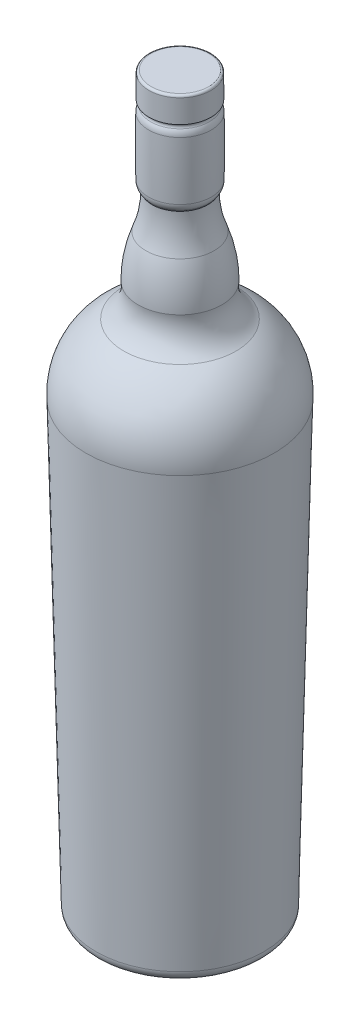
ISO-10303-21;
HEADER;
FILE_DESCRIPTION(('STEP AP214'),'2;1');
FILE_NAME('part.step','',(''),(''),'','','');
FILE_SCHEMA(('AUTOMOTIVE_DESIGN { 1 0 10303 214 1 1 1 1 }'));
ENDSEC;
DATA;
#1=APPLICATION_CONTEXT('core data for automotive mechanical design processes');
#2=APPLICATION_PROTOCOL_DEFINITION('international standard','automotive_design',2000,#1);
#3=PRODUCT_CONTEXT('',#1,'mechanical');
#4=PRODUCT('Part','Part','',(#3));
#5=PRODUCT_RELATED_PRODUCT_CATEGORY('part','',(#4));
#6=PRODUCT_DEFINITION_FORMATION('','',#4);
#7=PRODUCT_DEFINITION_CONTEXT('part definition',#1,'design');
#8=PRODUCT_DEFINITION('design','',#6,#7);
#9=PRODUCT_DEFINITION_SHAPE('','',#8);
#10=(LENGTH_UNIT() NAMED_UNIT(*) SI_UNIT(.MILLI.,.METRE.));
#11=(NAMED_UNIT(*) PLANE_ANGLE_UNIT() SI_UNIT($,.RADIAN.));
#12=(NAMED_UNIT(*) SI_UNIT($,.STERADIAN.) SOLID_ANGLE_UNIT());
#13=UNCERTAINTY_MEASURE_WITH_UNIT(LENGTH_MEASURE(1.E-05),#10,'distance_accuracy_value','');
#14=(GEOMETRIC_REPRESENTATION_CONTEXT(3) GLOBAL_UNCERTAINTY_ASSIGNED_CONTEXT((#13)) GLOBAL_UNIT_ASSIGNED_CONTEXT((#10,
#11,#12)) REPRESENTATION_CONTEXT('',''));
#15=CARTESIAN_POINT('',(0.,0.,0.));
#16=DIRECTION('',(0.,0.,1.));
#17=DIRECTION('',(1.,0.,0.));
#18=AXIS2_PLACEMENT_3D('',#15,#16,#17);
#19=CARTESIAN_POINT('',(920.92834183409,303.270607144107,0.));
#20=DIRECTION('',(0.,-1.,0.));
#21=DIRECTION('',(0.,0.,-1.));
#22=AXIS2_PLACEMENT_3D('',#19,#20,#21);
#23=PLANE('',#22);
#24=CARTESIAN_POINT('',(905.205998229429,303.270607144107,0.));
#25=DIRECTION('',(0.,1.,0.));
#26=DIRECTION('',(0.,0.,1.));
#27=AXIS2_PLACEMENT_3D('',#24,#25,#26);
#28=CIRCLE('',#27,15.7223436046606);
#29=CARTESIAN_POINT('',(905.205998229429,303.270607144107,15.7223436046606));
#30=VERTEX_POINT('',#29);
#31=EDGE_CURVE('E65',#30,#30,#28,.T.);
#32=ORIENTED_EDGE('',*,*,#31,.T.);
#33=EDGE_LOOP('',(#32));
#34=FACE_BOUND('',#33,.T.);
#35=ADVANCED_FACE('F40',(#34),#23,.F.);
#36=CARTESIAN_POINT('',(905.205998229429,40.2910251286174,0.));
#37=DIRECTION('',(0.,1.,0.));
#38=DIRECTION('',(-1.,0.,0.));
#39=AXIS2_PLACEMENT_3D('',#36,#37,#38);
#40=SPHERICAL_SURFACE('',#39,28.1);
#41=CARTESIAN_POINT('',(905.205998229429,59.05547695586,0.));
#42=DIRECTION('',(0.,1.,0.));
#43=DIRECTION('',(0.,0.,1.));
#44=AXIS2_PLACEMENT_3D('',#41,#42,#43);
#45=CIRCLE('',#44,20.9166284956035);
#46=CARTESIAN_POINT('',(905.205998229429,59.05547695586,20.9166284956035));
#47=VERTEX_POINT('',#46);
#48=EDGE_CURVE('E11',#47,#47,#45,.T.);
#49=ORIENTED_EDGE('',*,*,#48,.F.);
#50=EDGE_LOOP('',(#49));
#51=FACE_BOUND('',#50,.T.);
#52=ADVANCED_FACE('F101',(#51),#40,.F.);
#53=CARTESIAN_POINT('',(905.205998229429,60.3910251286174,0.));
#54=DIRECTION('',(0.,1.,0.));
#55=DIRECTION('',(0.,0.,1.));
#56=AXIS2_PLACEMENT_3D('',#53,#54,#55);
#57=TOROIDAL_SURFACE('',#56,22.405356502408,2.00000000000001);
#58=CARTESIAN_POINT('',(905.205998229429,58.3910251286174,0.));
#59=DIRECTION('',(0.,1.,0.));
#60=DIRECTION('',(0.,0.,1.));
#61=AXIS2_PLACEMENT_3D('',#58,#59,#60);
#62=CIRCLE('',#61,22.405356502408);
#63=CARTESIAN_POINT('',(905.205998229429,58.3910251286174,22.405356502408));
#64=VERTEX_POINT('',#63);
#65=EDGE_CURVE('E46',#64,#64,#62,.T.);
#66=ORIENTED_EDGE('',*,*,#65,.F.);
#67=EDGE_LOOP('',(#66));
#68=FACE_BOUND('',#67,.T.);
#69=ORIENTED_EDGE('',*,*,#48,.T.);
#70=EDGE_LOOP('',(#69));
#71=FACE_BOUND('',#70,.T.);
#72=ADVANCED_FACE('F96',(#68,#71),#57,.T.);
#73=CARTESIAN_POINT('',(927.611354731837,58.3910251286174,0.));
#74=DIRECTION('',(0.,1.,0.));
#75=DIRECTION('',(0.,0.,1.));
#76=AXIS2_PLACEMENT_3D('',#73,#74,#75);
#77=PLANE('',#76);
#78=CARTESIAN_POINT('',(905.205998229429,58.3910251286174,0.));
#79=DIRECTION('',(0.,1.,0.));
#80=DIRECTION('',(0.,0.,1.));
#81=AXIS2_PLACEMENT_3D('',#78,#79,#80);
#82=CIRCLE('',#81,32.7422963248204);
#83=CARTESIAN_POINT('',(905.205998229429,58.3910251286174,32.7422963248204));
#84=VERTEX_POINT('',#83);
#85=EDGE_CURVE('E50',#84,#84,#82,.T.);
#86=ORIENTED_EDGE('',*,*,#85,.F.);
#87=EDGE_LOOP('',(#86));
#88=FACE_BOUND('',#87,.T.);
#89=ORIENTED_EDGE('',*,*,#65,.T.);
#90=EDGE_LOOP('',(#89));
#91=FACE_BOUND('',#90,.T.);
#92=ADVANCED_FACE('F91',(#88,#91),#77,.F.);
#93=CARTESIAN_POINT('',(905.205998229429,60.3910251286174,0.));
#94=DIRECTION('',(0.,1.,0.));
#95=DIRECTION('',(0.,0.,1.));
#96=AXIS2_PLACEMENT_3D('',#93,#94,#95);
#97=TOROIDAL_SURFACE('',#96,32.7422963248205,1.99999999999998);
#98=CARTESIAN_POINT('',(905.205998229429,60.3446642904877,0.));
#99=DIRECTION('',(0.,1.,0.));
#100=DIRECTION('',(0.,0.,1.));
#101=AXIS2_PLACEMENT_3D('',#98,#99,#100);
#102=CIRCLE('',#101,34.7417589207917);
#103=CARTESIAN_POINT('',(905.205998229429,60.3446642904877,34.7417589207917));
#104=VERTEX_POINT('',#103);
#105=EDGE_CURVE('E54',#104,#104,#102,.T.);
#106=ORIENTED_EDGE('',*,*,#105,.F.);
#107=EDGE_LOOP('',(#106));
#108=FACE_BOUND('',#107,.T.);
#109=ORIENTED_EDGE('',*,*,#85,.T.);
#110=EDGE_LOOP('',(#109));
#111=FACE_BOUND('',#110,.T.);
#112=ADVANCED_FACE('F85',(#108,#111),#97,.T.);
#113=CARTESIAN_POINT('',(905.205998229429,60.3446642904877,0.));
#114=DIRECTION('',(0.,1.,0.));
#115=DIRECTION('',(0.,0.,1.));
#116=AXIS2_PLACEMENT_3D('',#113,#114,#115);
#117=CONICAL_SURFACE('',#116,34.7417589207917,0.0231824954964722);
#118=CARTESIAN_POINT('',(905.205998229429,257.104839063546,0.));
#119=DIRECTION('',(0.,1.,0.));
#120=DIRECTION('',(0.,0.,1.));
#121=AXIS2_PLACEMENT_3D('',#118,#119,#120);
#122=CIRCLE('',#121,39.3039681021037);
#123=CARTESIAN_POINT('',(905.205998229429,257.104839063546,39.3039681021037));
#124=VERTEX_POINT('',#123);
#125=EDGE_CURVE('E59',#124,#124,#122,.T.);
#126=ORIENTED_EDGE('',*,*,#125,.F.);
#127=EDGE_LOOP('',(#126));
#128=FACE_BOUND('',#127,.T.);
#129=ORIENTED_EDGE('',*,*,#105,.T.);
#130=EDGE_LOOP('',(#129));
#131=FACE_BOUND('',#130,.T.);
#132=ADVANCED_FACE('F79',(#128,#131),#117,.T.);
#133=CARTESIAN_POINT('',(905.205998229429,259.023287921556,0.));
#134=DIRECTION('',(0.,1.,0.));
#135=DIRECTION('',(0.,0.,1.));
#136=AXIS2_PLACEMENT_3D('',#133,#134,#135);
#137=DEGENERATE_TOROIDAL_SURFACE('',#136,8.99236689842386,30.3722507159368,.T.);
#138=CARTESIAN_POINT('',(905.205998229429,285.609893903162,0.));
#139=DIRECTION('',(0.,1.,0.));
#140=DIRECTION('',(0.,0.,1.));
#141=AXIS2_PLACEMENT_3D('',#138,#139,#140);
#142=CIRCLE('',#141,23.6765759656689);
#143=CARTESIAN_POINT('',(905.205998229429,285.609893903162,23.6765759656689));
#144=VERTEX_POINT('',#143);
#145=EDGE_CURVE('E62',#144,#144,#142,.T.);
#146=ORIENTED_EDGE('',*,*,#145,.F.);
#147=EDGE_LOOP('',(#146));
#148=FACE_BOUND('',#147,.T.);
#149=ORIENTED_EDGE('',*,*,#125,.T.);
#150=EDGE_LOOP('',(#149));
#151=FACE_BOUND('',#150,.T.);
#152=ADVANCED_FACE('F73',(#148,#151),#137,.T.);
#153=CARTESIAN_POINT('',(905.205998229429,300.780356638458,0.));
#154=DIRECTION('',(0.,1.,0.));
#155=DIRECTION('',(0.,0.,1.));
#156=AXIS2_PLACEMENT_3D('',#153,#154,#155);
#157=TOROIDAL_SURFACE('',#156,33.7763424973108,18.22493411776);
#158=ORIENTED_EDGE('',*,*,#31,.F.);
#159=EDGE_LOOP('',(#158));
#160=FACE_BOUND('',#159,.T.);
#161=ORIENTED_EDGE('',*,*,#145,.T.);
#162=EDGE_LOOP('',(#161));
#163=FACE_BOUND('',#162,.T.);
#164=ADVANCED_FACE('F70',(#160,#163),#157,.F.);
#165=CLOSED_SHELL('',(#35,#52,#72,#92,#112,#132,#152,#164));
#166=MANIFOLD_SOLID_BREP('B2',#165);
#167=CARTESIAN_POINT('',(905.205998229429,55.2910251286174,0.));
#168=DIRECTION('',(0.,1.,0.));
#169=DIRECTION('',(0.,0.,1.));
#170=AXIS2_PLACEMENT_3D('',#167,#168,#169);
#171=PLANE('',#170);
#172=CARTESIAN_POINT('',(905.205998229429,55.2910251286174,0.));
#173=DIRECTION('',(0.,1.,0.));
#174=DIRECTION('',(0.,0.,1.));
#175=AXIS2_PLACEMENT_3D('',#172,#173,#174);
#176=CIRCLE('',#175,22.3606797749979);
#177=CARTESIAN_POINT('',(905.205998229429,55.2910251286174,22.3606797749979));
#178=VERTEX_POINT('',#177);
#179=EDGE_CURVE('E215',#178,#178,#176,.T.);
#180=ORIENTED_EDGE('',*,*,#179,.T.);
#181=EDGE_LOOP('',(#180));
#182=FACE_BOUND('',#181,.T.);
#183=CARTESIAN_POINT('',(905.205998229429,55.2910251286174,0.));
#184=DIRECTION('',(0.,1.,0.));
#185=DIRECTION('',(0.,0.,1.));
#186=AXIS2_PLACEMENT_3D('',#183,#184,#185);
#187=CIRCLE('',#186,32.8400045373074);
#188=CARTESIAN_POINT('',(905.205998229429,55.2910251286174,32.8400045373074));
#189=VERTEX_POINT('',#188);
#190=EDGE_CURVE('E240',#189,#189,#187,.F.);
#191=ORIENTED_EDGE('',*,*,#190,.T.);
#192=EDGE_LOOP('',(#191));
#193=FACE_BOUND('',#192,.T.);
#194=ADVANCED_FACE('F156',(#182,#193),#171,.F.);
#195=CARTESIAN_POINT('',(905.205998229429,55.2910251286174,0.));
#196=DIRECTION('',(0.,1.,0.));
#197=DIRECTION('',(0.,0.,1.));
#198=AXIS2_PLACEMENT_3D('',#195,#196,#197);
#199=CONICAL_SURFACE('',#198,37.7254151616591,0.0231824954964722);
#200=CARTESIAN_POINT('',(905.205998229429,60.175123033293,0.));
#201=DIRECTION('',(0.,-1.,0.));
#202=DIRECTION('',(0.,0.,-1.));
#203=AXIS2_PLACEMENT_3D('',#200,#201,#202);
#204=CIRCLE('',#203,37.8386610272355);
#205=CARTESIAN_POINT('',(905.205998229429,60.175123033293,-37.8386610272355));
#206=VERTEX_POINT('',#205);
#207=EDGE_CURVE('E243',#206,#206,#204,.F.);
#208=ORIENTED_EDGE('',*,*,#207,.T.);
#209=EDGE_LOOP('',(#208));
#210=FACE_BOUND('',#209,.T.);
#211=CARTESIAN_POINT('',(905.205998229429,256.972458170906,0.));
#212=DIRECTION('',(0.,1.,0.));
#213=DIRECTION('',(0.,0.,1.));
#214=AXIS2_PLACEMENT_3D('',#211,#212,#213);
#215=CIRCLE('',#214,42.4017318328906);
#216=CARTESIAN_POINT('',(905.205998229429,256.972458170906,42.4017318328906));
#217=VERTEX_POINT('',#216);
#218=EDGE_CURVE('E246',#217,#217,#215,.T.);
#219=ORIENTED_EDGE('',*,*,#218,.F.);
#220=EDGE_LOOP('',(#219));
#221=FACE_BOUND('',#220,.T.);
#222=ADVANCED_FACE('F283',(#210,#221),#199,.T.);
#223=CARTESIAN_POINT('',(905.205998229429,259.023287921556,0.));
#224=DIRECTION('',(0.,1.,0.));
#225=DIRECTION('',(0.,0.,1.));
#226=AXIS2_PLACEMENT_3D('',#223,#224,#225);
#227=DEGENERATE_TOROIDAL_SURFACE('',#226,8.99236689842386,33.4722507159367,.T.);
#228=CARTESIAN_POINT('',(905.205998229429,288.256816970191,0.));
#229=DIRECTION('',(0.,1.,0.));
#230=DIRECTION('',(0.,0.,1.));
#231=AXIS2_PLACEMENT_3D('',#228,#229,#230);
#232=CIRCLE('',#231,25.2955060854982);
#233=CARTESIAN_POINT('',(905.205998229429,288.256816970191,25.2955060854982));
#234=VERTEX_POINT('',#233);
#235=EDGE_CURVE('E249',#234,#234,#232,.T.);
#236=ORIENTED_EDGE('',*,*,#235,.F.);
#237=EDGE_LOOP('',(#236));
#238=FACE_BOUND('',#237,.T.);
#239=ORIENTED_EDGE('',*,*,#218,.T.);
#240=EDGE_LOOP('',(#239));
#241=FACE_BOUND('',#240,.T.);
#242=ADVANCED_FACE('F288',(#238,#241),#227,.T.);
#243=CARTESIAN_POINT('',(905.205998229429,300.780356638458,0.));
#244=DIRECTION('',(0.,1.,0.));
#245=DIRECTION('',(0.,0.,1.));
#246=AXIS2_PLACEMENT_3D('',#243,#244,#245);
#247=TOROIDAL_SURFACE('',#246,33.7763424973108,15.12493411776);
#248=CARTESIAN_POINT('',(905.205998229429,303.051390589558,0.));
#249=DIRECTION('',(0.,1.,0.));
#250=DIRECTION('',(0.,0.,1.));
#251=AXIS2_PLACEMENT_3D('',#248,#249,#250);
#252=CIRCLE('',#251,18.8228801270256);
#253=CARTESIAN_POINT('',(905.205998229429,303.051390589558,18.8228801270256));
#254=VERTEX_POINT('',#253);
#255=EDGE_CURVE('E252',#254,#254,#252,.T.);
#256=ORIENTED_EDGE('',*,*,#255,.F.);
#257=EDGE_LOOP('',(#256));
#258=FACE_BOUND('',#257,.T.);
#259=ORIENTED_EDGE('',*,*,#235,.T.);
#260=EDGE_LOOP('',(#259));
#261=FACE_BOUND('',#260,.T.);
#262=ADVANCED_FACE('F580',(#258,#261),#247,.F.);
#263=CARTESIAN_POINT('',(905.205998229429,303.031582756078,0.));
#264=DIRECTION('',(0.,1.,0.));
#265=DIRECTION('',(0.,0.,1.));
#266=AXIS2_PLACEMENT_3D('',#263,#264,#265);
#267=DEGENERATE_TOROIDAL_SURFACE('',#266,37.1754885082419,55.9983721384969,.F.);
#268=CARTESIAN_POINT('',(905.205998229429,322.432334548043,0.));
#269=DIRECTION('',(0.,1.,0.));
#270=DIRECTION('',(0.,0.,1.));
#271=AXIS2_PLACEMENT_3D('',#268,#269,#270);
#272=CIRCLE('',#271,15.3547743129941);
#273=CARTESIAN_POINT('',(905.205998229429,322.432334548043,15.3547743129941));
#274=VERTEX_POINT('',#273);
#275=EDGE_CURVE('E255',#274,#274,#272,.T.);
#276=ORIENTED_EDGE('',*,*,#275,.F.);
#277=EDGE_LOOP('',(#276));
#278=FACE_BOUND('',#277,.T.);
#279=ORIENTED_EDGE('',*,*,#255,.T.);
#280=EDGE_LOOP('',(#279));
#281=FACE_BOUND('',#280,.T.);
#282=ADVANCED_FACE('F570',(#278,#281),#267,.F.);
#283=CARTESIAN_POINT('',(905.205998229429,337.567379504665,0.));
#284=DIRECTION('',(0.,1.,0.));
#285=DIRECTION('',(0.,0.,1.));
#286=AXIS2_PLACEMENT_3D('',#283,#284,#285);
#287=TOROIDAL_SURFACE('',#286,54.4644174558376,41.936067681645);
#288=CARTESIAN_POINT('',(905.205998229429,339.005004961465,0.));
#289=DIRECTION('',(0.,1.,0.));
#290=DIRECTION('',(0.,0.,1.));
#291=AXIS2_PLACEMENT_3D('',#288,#289,#290);
#292=CIRCLE('',#291,12.5529988966255);
#293=CARTESIAN_POINT('',(905.205998229429,339.005004961465,12.5529988966255));
#294=VERTEX_POINT('',#293);
#295=EDGE_CURVE('E258',#294,#294,#292,.T.);
#296=ORIENTED_EDGE('',*,*,#295,.F.);
#297=EDGE_LOOP('',(#296));
#298=FACE_BOUND('',#297,.T.);
#299=ORIENTED_EDGE('',*,*,#275,.T.);
#300=EDGE_LOOP('',(#299));
#301=FACE_BOUND('',#300,.T.);
#302=ADVANCED_FACE('F548',(#298,#301),#287,.F.);
#303=CARTESIAN_POINT('',(905.205998229429,338.453173654689,0.));
#304=DIRECTION('',(0.,1.,0.));
#305=DIRECTION('',(0.,0.,1.));
#306=AXIS2_PLACEMENT_3D('',#303,#304,#305);
#307=TOROIDAL_SURFACE('',#306,14.264652004757,1.79840878381818);
#308=CARTESIAN_POINT('',(905.205998229429,339.620111566195,0.));
#309=DIRECTION('',(0.,-1.,0.));
#310=DIRECTION('',(0.,0.,-1.));
#311=AXIS2_PLACEMENT_3D('',#308,#309,#310);
#312=CIRCLE('',#311,12.896247801166);
#313=CARTESIAN_POINT('',(905.205998229429,339.620111566195,-12.896247801166));
#314=VERTEX_POINT('',#313);
#315=EDGE_CURVE('E231',#314,#314,#312,.T.);
#316=ORIENTED_EDGE('',*,*,#315,.T.);
#317=EDGE_LOOP('',(#316));
#318=FACE_BOUND('',#317,.T.);
#319=ORIENTED_EDGE('',*,*,#295,.T.);
#320=EDGE_LOOP('',(#319));
#321=FACE_BOUND('',#320,.T.);
#322=ADVANCED_FACE('F279',(#318,#321),#307,.F.);
#323=CARTESIAN_POINT('',(905.205998229429,355.661055590829,0.));
#324=DIRECTION('',(0.,1.,0.));
#325=DIRECTION('',(0.,0.,1.));
#326=AXIS2_PLACEMENT_3D('',#323,#324,#325);
#327=DEGENERATE_TOROIDAL_SURFACE('',#326,580.214609807362,594.445291895973,.F.);
#328=CARTESIAN_POINT('',(905.205998229429,342.755926147209,0.));
#329=DIRECTION('',(0.,1.,0.));
#330=DIRECTION('',(0.,0.,1.));
#331=AXIS2_PLACEMENT_3D('',#328,#329,#330);
#332=CIRCLE('',#331,14.0905834152216);
#333=CARTESIAN_POINT('',(905.205998229429,342.755926147209,14.0905834152216));
#334=VERTEX_POINT('',#333);
#335=EDGE_CURVE('E234',#334,#334,#332,.T.);
#336=ORIENTED_EDGE('',*,*,#335,.T.);
#337=EDGE_LOOP('',(#336));
#338=FACE_BOUND('',#337,.T.);
#339=CARTESIAN_POINT('',(905.205998229429,368.905535345722,0.));
#340=DIRECTION('',(0.,-1.,0.));
#341=DIRECTION('',(0.,0.,-1.));
#342=AXIS2_PLACEMENT_3D('',#339,#340,#341);
#343=CIRCLE('',#342,14.0831176098908);
#344=CARTESIAN_POINT('',(905.205998229429,368.905535345722,-14.0831176098908));
#345=VERTEX_POINT('',#344);
#346=EDGE_CURVE('E237',#345,#345,#343,.T.);
#347=ORIENTED_EDGE('',*,*,#346,.T.);
#348=EDGE_LOOP('',(#347));
#349=FACE_BOUND('',#348,.T.);
#350=ADVANCED_FACE('F269',(#338,#349),#327,.F.);
#351=CARTESIAN_POINT('',(905.205998229429,372.46552676804,0.));
#352=DIRECTION('',(0.,1.,0.));
#353=DIRECTION('',(0.,0.,1.));
#354=AXIS2_PLACEMENT_3D('',#351,#352,#353);
#355=TOROIDAL_SURFACE('',#354,14.3449680747886,1.41507128629271);
#356=CARTESIAN_POINT('',(905.205998229429,371.655670853562,0.));
#357=DIRECTION('',(0.,1.,0.));
#358=DIRECTION('',(0.,0.,1.));
#359=AXIS2_PLACEMENT_3D('',#356,#357,#358);
#360=CIRCLE('',#359,13.184554293814);
#361=CARTESIAN_POINT('',(905.205998229429,371.655670853562,13.184554293814));
#362=VERTEX_POINT('',#361);
#363=EDGE_CURVE('E228',#362,#362,#360,.T.);
#364=ORIENTED_EDGE('',*,*,#363,.T.);
#365=EDGE_LOOP('',(#364));
#366=FACE_BOUND('',#365,.T.);
#367=CARTESIAN_POINT('',(905.205998229429,373.827048959516,0.));
#368=DIRECTION('',(0.,1.,0.));
#369=DIRECTION('',(0.,0.,1.));
#370=AXIS2_PLACEMENT_3D('',#367,#368,#369);
#371=CIRCLE('',#370,13.9593723442542);
#372=CARTESIAN_POINT('',(905.205998229429,373.827048959516,13.9593723442542));
#373=VERTEX_POINT('',#372);
#374=EDGE_CURVE('E261',#373,#373,#371,.T.);
#375=ORIENTED_EDGE('',*,*,#374,.F.);
#376=EDGE_LOOP('',(#375));
#377=FACE_BOUND('',#376,.T.);
#378=ADVANCED_FACE('F267',(#366,#377),#355,.F.);
#379=CARTESIAN_POINT('',(905.205998229429,385.291025128617,0.));
#380=DIRECTION('',(0.,1.,0.));
#381=DIRECTION('',(0.,0.,1.));
#382=AXIS2_PLACEMENT_3D('',#379,#380,#381);
#383=CYLINDRICAL_SURFACE('',#382,13.9593723442542);
#384=CARTESIAN_POINT('',(905.205998229429,384.291025128617,0.));
#385=DIRECTION('',(0.,-1.,0.));
#386=DIRECTION('',(0.,0.,-1.));
#387=AXIS2_PLACEMENT_3D('',#384,#385,#386);
#388=CIRCLE('',#387,13.9593723442542);
#389=CARTESIAN_POINT('',(905.205998229429,384.291025128617,-13.9593723442542));
#390=VERTEX_POINT('',#389);
#391=EDGE_CURVE('E219',#390,#390,#388,.T.);
#392=ORIENTED_EDGE('',*,*,#391,.T.);
#393=EDGE_LOOP('',(#392));
#394=FACE_BOUND('',#393,.T.);
#395=ORIENTED_EDGE('',*,*,#374,.T.);
#396=EDGE_LOOP('',(#395));
#397=FACE_BOUND('',#396,.T.);
#398=ADVANCED_FACE('F265',(#394,#397),#383,.T.);
#399=CARTESIAN_POINT('',(919.165370573683,385.291025128617,0.));
#400=DIRECTION('',(0.,-1.,0.));
#401=DIRECTION('',(0.,0.,-1.));
#402=AXIS2_PLACEMENT_3D('',#399,#400,#401);
#403=PLANE('',#402);
#404=CARTESIAN_POINT('',(905.205998229429,385.291025128617,0.));
#405=DIRECTION('',(0.,-1.,0.));
#406=DIRECTION('',(0.,0.,-1.));
#407=AXIS2_PLACEMENT_3D('',#404,#405,#406);
#408=CIRCLE('',#407,12.9593723442541);
#409=CARTESIAN_POINT('',(905.205998229429,385.291025128617,-12.9593723442541));
#410=VERTEX_POINT('',#409);
#411=EDGE_CURVE('E223',#410,#410,#408,.F.);
#412=ORIENTED_EDGE('',*,*,#411,.T.);
#413=EDGE_LOOP('',(#412));
#414=FACE_BOUND('',#413,.T.);
#415=ADVANCED_FACE('F276',(#414),#403,.F.);
#416=CARTESIAN_POINT('',(905.205998229429,60.2910251286174,0.));
#417=DIRECTION('',(0.,1.,0.));
#418=DIRECTION('',(0.,0.,1.));
#419=AXIS2_PLACEMENT_3D('',#416,#417,#418);
#420=TOROIDAL_SURFACE('',#419,32.8400045373074,5.);
#421=ORIENTED_EDGE('',*,*,#190,.F.);
#422=EDGE_LOOP('',(#421));
#423=FACE_BOUND('',#422,.T.);
#424=ORIENTED_EDGE('',*,*,#207,.F.);
#425=EDGE_LOOP('',(#424));
#426=FACE_BOUND('',#425,.T.);
#427=ADVANCED_FACE('F294',(#423,#426),#420,.T.);
#428=CARTESIAN_POINT('',(905.205998229429,342.864473810211,0.));
#429=DIRECTION('',(0.,-1.,0.));
#430=DIRECTION('',(0.,0.,-1.));
#431=AXIS2_PLACEMENT_3D('',#428,#429,#430);
#432=TOROIDAL_SURFACE('',#431,9.09176181359823,5.);
#433=ORIENTED_EDGE('',*,*,#315,.F.);
#434=EDGE_LOOP('',(#433));
#435=FACE_BOUND('',#434,.T.);
#436=ORIENTED_EDGE('',*,*,#335,.F.);
#437=EDGE_LOOP('',(#436));
#438=FACE_BOUND('',#437,.T.);
#439=ADVANCED_FACE('F297',(#435,#438),#432,.T.);
#440=CARTESIAN_POINT('',(905.205998229429,368.794133338377,0.));
#441=DIRECTION('',(0.,-1.,0.));
#442=DIRECTION('',(0.,0.,-1.));
#443=AXIS2_PLACEMENT_3D('',#440,#441,#442);
#444=TOROIDAL_SURFACE('',#443,9.08435880467131,5.);
#445=ORIENTED_EDGE('',*,*,#346,.F.);
#446=EDGE_LOOP('',(#445));
#447=FACE_BOUND('',#446,.T.);
#448=ORIENTED_EDGE('',*,*,#363,.F.);
#449=EDGE_LOOP('',(#448));
#450=FACE_BOUND('',#449,.T.);
#451=ADVANCED_FACE('F301',(#447,#450),#444,.T.);
#452=CARTESIAN_POINT('',(905.205998229429,384.291025128617,0.));
#453=DIRECTION('',(0.,-1.,0.));
#454=DIRECTION('',(0.,0.,-1.));
#455=AXIS2_PLACEMENT_3D('',#452,#453,#454);
#456=TOROIDAL_SURFACE('',#455,12.9593723442541,1.);
#457=ORIENTED_EDGE('',*,*,#391,.F.);
#458=EDGE_LOOP('',(#457));
#459=FACE_BOUND('',#458,.T.);
#460=ORIENTED_EDGE('',*,*,#411,.F.);
#461=EDGE_LOOP('',(#460));
#462=FACE_BOUND('',#461,.T.);
#463=ADVANCED_FACE('F305',(#459,#462),#456,.T.);
#464=CARTESIAN_POINT('',(905.205998229429,40.2910251286174,0.));
#465=DIRECTION('',(0.,-1.,0.));
#466=DIRECTION('',(-1.,0.,0.));
#467=AXIS2_PLACEMENT_3D('',#464,#465,#466);
#468=SPHERICAL_SURFACE('',#467,25.);
#469=CARTESIAN_POINT('',(905.205998229429,56.9576917952841,0.));
#470=DIRECTION('',(0.,-1.,0.));
#471=DIRECTION('',(0.,0.,-1.));
#472=AXIS2_PLACEMENT_3D('',#469,#470,#471);
#473=CIRCLE('',#472,18.6338998124983);
#474=CARTESIAN_POINT('',(905.205998229429,56.9576917952841,-18.6338998124983));
#475=VERTEX_POINT('',#474);
#476=EDGE_CURVE('E173',#475,#475,#473,.T.);
#477=ORIENTED_EDGE('',*,*,#476,.T.);
#478=EDGE_LOOP('',(#477));
#479=FACE_BOUND('',#478,.T.);
#480=ADVANCED_FACE('F309',(#479),#468,.F.);
#481=CARTESIAN_POINT('',(905.205998229429,60.2910251286174,0.));
#482=DIRECTION('',(0.,1.,0.));
#483=DIRECTION('',(0.,0.,1.));
#484=AXIS2_PLACEMENT_3D('',#481,#482,#483);
#485=TOROIDAL_SURFACE('',#484,22.3606797749979,5.);
#486=ORIENTED_EDGE('',*,*,#476,.F.);
#487=EDGE_LOOP('',(#486));
#488=FACE_BOUND('',#487,.T.);
#489=ORIENTED_EDGE('',*,*,#179,.F.);
#490=EDGE_LOOP('',(#489));
#491=FACE_BOUND('',#490,.T.);
#492=ADVANCED_FACE('F311',(#488,#491),#485,.T.);
#493=CLOSED_SHELL('',(#194,#222,#242,#262,#282,#302,#322,#350,#378,#398,#415,#427,#439,#451,
#463,#480,#492));
#494=CARTESIAN_POINT('',(905.205998229429,58.2910251286174,0.));
#495=DIRECTION('',(0.,1.,0.));
#496=DIRECTION('',(0.,0.,1.));
#497=AXIS2_PLACEMENT_3D('',#494,#495,#496);
#498=PLANE('',#497);
#499=CARTESIAN_POINT('',(905.205998229429,58.2910251286174,0.));
#500=DIRECTION('',(0.,1.,0.));
#501=DIRECTION('',(0.,0.,1.));
#502=AXIS2_PLACEMENT_3D('',#499,#500,#501);
#503=CIRCLE('',#502,22.3606797749979);
#504=CARTESIAN_POINT('',(905.205998229429,58.2910251286174,22.3606797749979));
#505=VERTEX_POINT('',#504);
#506=EDGE_CURVE('E160',#505,#505,#503,.T.);
#507=ORIENTED_EDGE('',*,*,#506,.F.);
#508=EDGE_LOOP('',(#507));
#509=FACE_BOUND('',#508,.T.);
#510=CARTESIAN_POINT('',(905.205998229429,58.2910251286174,0.));
#511=DIRECTION('',(0.,1.,0.));
#512=DIRECTION('',(0.,0.,1.));
#513=AXIS2_PLACEMENT_3D('',#510,#511,#512);
#514=CIRCLE('',#513,32.8400045373074);
#515=CARTESIAN_POINT('',(905.205998229429,58.2910251286174,32.8400045373074));
#516=VERTEX_POINT('',#515);
#517=EDGE_CURVE('E207',#516,#516,#514,.F.);
#518=ORIENTED_EDGE('',*,*,#517,.F.);
#519=EDGE_LOOP('',(#518));
#520=FACE_BOUND('',#519,.T.);
#521=ADVANCED_FACE('F315',(#509,#520),#498,.T.);
#522=CARTESIAN_POINT('',(905.205998229429,55.360566385812,0.));
#523=DIRECTION('',(0.,1.,0.));
#524=DIRECTION('',(0.,0.,1.));
#525=AXIS2_PLACEMENT_3D('',#522,#523,#524);
#526=CONICAL_SURFACE('',#525,34.7262212677023,0.0231824954964722);
#527=CARTESIAN_POINT('',(905.205998229429,60.2446642904876,0.));
#528=DIRECTION('',(0.,1.,0.));
#529=DIRECTION('',(0.,0.,1.));
#530=AXIS2_PLACEMENT_3D('',#527,#528,#529);
#531=CIRCLE('',#530,34.8394671332786);
#532=CARTESIAN_POINT('',(905.205998229429,60.2446642904876,34.8394671332786));
#533=VERTEX_POINT('',#532);
#534=EDGE_CURVE('E205',#533,#533,#531,.T.);
#535=ORIENTED_EDGE('',*,*,#534,.F.);
#536=EDGE_LOOP('',(#535));
#537=FACE_BOUND('',#536,.T.);
#538=CARTESIAN_POINT('',(905.205998229429,257.100521731231,0.));
#539=DIRECTION('',(0.,1.,0.));
#540=DIRECTION('',(0.,0.,1.));
#541=AXIS2_PLACEMENT_3D('',#538,#539,#540);
#542=CIRCLE('',#541,39.4038948750565);
#543=CARTESIAN_POINT('',(905.205998229429,257.100521731231,39.4038948750565));
#544=VERTEX_POINT('',#543);
#545=EDGE_CURVE('E202',#544,#544,#542,.T.);
#546=ORIENTED_EDGE('',*,*,#545,.T.);
#547=EDGE_LOOP('',(#546));
#548=FACE_BOUND('',#547,.T.);
#549=ADVANCED_FACE('F318',(#537,#548),#526,.F.);
#550=CARTESIAN_POINT('',(905.205998229429,259.023287921556,0.));
#551=DIRECTION('',(0.,1.,0.));
#552=DIRECTION('',(0.,0.,1.));
#553=AXIS2_PLACEMENT_3D('',#550,#551,#552);
#554=DEGENERATE_TOROIDAL_SURFACE('',#553,8.99236689842386,30.4722507159367,.T.);
#555=CARTESIAN_POINT('',(905.205998229429,285.695423593911,0.));
#556=DIRECTION('',(0.,-1.,0.));
#557=DIRECTION('',(0.,0.,-1.));
#558=AXIS2_PLACEMENT_3D('',#555,#556,#557);
#559=CIRCLE('',#558,23.7285550883994);
#560=CARTESIAN_POINT('',(905.205998229429,285.695423593911,-23.7285550883994));
#561=VERTEX_POINT('',#560);
#562=EDGE_CURVE('E199',#561,#561,#559,.F.);
#563=ORIENTED_EDGE('',*,*,#562,.T.);
#564=EDGE_LOOP('',(#563));
#565=FACE_BOUND('',#564,.T.);
#566=ORIENTED_EDGE('',*,*,#545,.F.);
#567=EDGE_LOOP('',(#566));
#568=FACE_BOUND('',#567,.T.);
#569=ADVANCED_FACE('F323',(#565,#568),#554,.F.);
#570=CARTESIAN_POINT('',(905.205998229429,300.780356638458,0.));
#571=DIRECTION('',(0.,1.,0.));
#572=DIRECTION('',(0.,0.,1.));
#573=AXIS2_PLACEMENT_3D('',#570,#571,#572);
#574=TOROIDAL_SURFACE('',#573,33.7763424973108,18.12493411776);
#575=CARTESIAN_POINT('',(905.205998229429,303.263954729098,0.));
#576=DIRECTION('',(0.,-1.,0.));
#577=DIRECTION('',(0.,0.,-1.));
#578=AXIS2_PLACEMENT_3D('',#575,#576,#577);
#579=CIRCLE('',#578,15.8223742090105);
#580=CARTESIAN_POINT('',(905.205998229429,303.263954729098,-15.8223742090105));
#581=VERTEX_POINT('',#580);
#582=EDGE_CURVE('E196',#581,#581,#579,.F.);
#583=ORIENTED_EDGE('',*,*,#582,.T.);
#584=EDGE_LOOP('',(#583));
#585=FACE_BOUND('',#584,.T.);
#586=ORIENTED_EDGE('',*,*,#562,.F.);
#587=EDGE_LOOP('',(#586));
#588=FACE_BOUND('',#587,.T.);
#589=ADVANCED_FACE('F327',(#585,#588),#574,.T.);
#590=CARTESIAN_POINT('',(905.205998229429,303.031582756078,0.));
#591=DIRECTION('',(0.,1.,0.));
#592=DIRECTION('',(0.,0.,1.));
#593=AXIS2_PLACEMENT_3D('',#590,#591,#592);
#594=DEGENERATE_TOROIDAL_SURFACE('',#593,37.1754885082419,52.9983721384969,.F.);
#595=CARTESIAN_POINT('',(905.205998229429,321.371904842465,0.));
#596=DIRECTION('',(0.,-1.,0.));
#597=DIRECTION('',(0.,0.,-1.));
#598=AXIS2_PLACEMENT_3D('',#595,#596,#597);
#599=CIRCLE('',#598,12.5483491865516);
#600=CARTESIAN_POINT('',(905.205998229429,321.371904842465,-12.5483491865516));
#601=VERTEX_POINT('',#600);
#602=EDGE_CURVE('E193',#601,#601,#599,.F.);
#603=ORIENTED_EDGE('',*,*,#602,.T.);
#604=EDGE_LOOP('',(#603));
#605=FACE_BOUND('',#604,.T.);
#606=ORIENTED_EDGE('',*,*,#582,.F.);
#607=EDGE_LOOP('',(#606));
#608=FACE_BOUND('',#607,.T.);
#609=ADVANCED_FACE('F331',(#605,#608),#594,.T.);
#610=CARTESIAN_POINT('',(905.205998229429,337.567379504665,0.));
#611=DIRECTION('',(0.,1.,0.));
#612=DIRECTION('',(0.,0.,1.));
#613=AXIS2_PLACEMENT_3D('',#610,#611,#612);
#614=TOROIDAL_SURFACE('',#613,54.4644174558376,44.936067681645);
#615=CARTESIAN_POINT('',(905.205998229429,339.43148045438,0.));
#616=DIRECTION('',(0.,1.,0.));
#617=DIRECTION('',(0.,0.,1.));
#618=AXIS2_PLACEMENT_3D('',#615,#616,#617);
#619=CIRCLE('',#618,9.56703104706682);
#620=CARTESIAN_POINT('',(905.205998229429,339.43148045438,9.56703104706682));
#621=VERTEX_POINT('',#620);
#622=EDGE_CURVE('E187',#621,#621,#619,.T.);
#623=ORIENTED_EDGE('',*,*,#622,.T.);
#624=EDGE_LOOP('',(#623));
#625=FACE_BOUND('',#624,.T.);
#626=ORIENTED_EDGE('',*,*,#602,.F.);
#627=EDGE_LOOP('',(#626));
#628=FACE_BOUND('',#627,.T.);
#629=ADVANCED_FACE('F335',(#625,#628),#614,.T.);
#630=CARTESIAN_POINT('',(905.205998229429,338.453173654689,0.));
#631=DIRECTION('',(0.,1.,0.));
#632=DIRECTION('',(0.,0.,1.));
#633=AXIS2_PLACEMENT_3D('',#630,#631,#632);
#634=TOROIDAL_SURFACE('',#633,14.264652004757,4.79840878381818);
#635=CARTESIAN_POINT('',(905.205998229429,341.566728912605,0.));
#636=DIRECTION('',(0.,1.,0.));
#637=DIRECTION('',(0.,0.,1.));
#638=AXIS2_PLACEMENT_3D('',#635,#636,#637);
#639=CIRCLE('',#638,10.6135562086253);
#640=CARTESIAN_POINT('',(905.205998229429,341.566728912605,10.6135562086253));
#641=VERTEX_POINT('',#640);
#642=EDGE_CURVE('E190',#641,#641,#639,.F.);
#643=ORIENTED_EDGE('',*,*,#642,.F.);
#644=EDGE_LOOP('',(#643));
#645=FACE_BOUND('',#644,.T.);
#646=ORIENTED_EDGE('',*,*,#622,.F.);
#647=EDGE_LOOP('',(#646));
#648=FACE_BOUND('',#647,.T.);
#649=ADVANCED_FACE('F339',(#645,#648),#634,.T.);
#650=CARTESIAN_POINT('',(905.205998229429,355.661055590829,0.));
#651=DIRECTION('',(0.,1.,0.));
#652=DIRECTION('',(0.,0.,1.));
#653=AXIS2_PLACEMENT_3D('',#650,#651,#652);
#654=DEGENERATE_TOROIDAL_SURFACE('',#653,580.214609807362,591.445291895973,.F.);
#655=CARTESIAN_POINT('',(905.205998229429,342.82105474501,0.));
#656=DIRECTION('',(0.,1.,0.));
#657=DIRECTION('',(0.,0.,1.));
#658=AXIS2_PLACEMENT_3D('',#655,#656,#657);
#659=CIRCLE('',#658,11.0912904542476);
#660=CARTESIAN_POINT('',(905.205998229429,342.82105474501,11.0912904542476));
#661=VERTEX_POINT('',#660);
#662=EDGE_CURVE('E184',#661,#661,#659,.T.);
#663=ORIENTED_EDGE('',*,*,#662,.F.);
#664=EDGE_LOOP('',(#663));
#665=FACE_BOUND('',#664,.T.);
#666=CARTESIAN_POINT('',(905.205998229429,368.838694141315,0.));
#667=DIRECTION('',(0.,1.,0.));
#668=DIRECTION('',(0.,0.,1.));
#669=AXIS2_PLACEMENT_3D('',#666,#667,#668);
#670=CIRCLE('',#669,11.0838623267591);
#671=CARTESIAN_POINT('',(905.205998229429,368.838694141315,11.0838623267591));
#672=VERTEX_POINT('',#671);
#673=EDGE_CURVE('E181',#672,#672,#670,.F.);
#674=ORIENTED_EDGE('',*,*,#673,.F.);
#675=EDGE_LOOP('',(#674));
#676=FACE_BOUND('',#675,.T.);
#677=ADVANCED_FACE('F343',(#665,#676),#654,.T.);
#678=CARTESIAN_POINT('',(905.205998229429,372.46552676804,0.));
#679=DIRECTION('',(0.,1.,0.));
#680=DIRECTION('',(0.,0.,1.));
#681=AXIS2_PLACEMENT_3D('',#678,#679,#680);
#682=TOROIDAL_SURFACE('',#681,14.3449680747886,4.41507128629271);
#683=CARTESIAN_POINT('',(905.205998229429,369.938748344451,0.));
#684=DIRECTION('',(0.,1.,0.));
#685=DIRECTION('',(0.,0.,1.));
#686=AXIS2_PLACEMENT_3D('',#683,#684,#685);
#687=CIRCLE('',#686,10.7244370003283);
#688=CARTESIAN_POINT('',(905.205998229429,369.938748344451,10.7244370003283));
#689=VERTEX_POINT('',#688);
#690=EDGE_CURVE('E178',#689,#689,#687,.T.);
#691=ORIENTED_EDGE('',*,*,#690,.F.);
#692=EDGE_LOOP('',(#691));
#693=FACE_BOUND('',#692,.T.);
#694=CARTESIAN_POINT('',(905.205998229429,375.299357393259,0.));
#695=DIRECTION('',(0.,-1.,0.));
#696=DIRECTION('',(0.,0.,-1.));
#697=AXIS2_PLACEMENT_3D('',#694,#695,#696);
#698=CIRCLE('',#697,10.9593723442542);
#699=CARTESIAN_POINT('',(905.205998229429,375.299357393259,-10.9593723442542));
#700=VERTEX_POINT('',#699);
#701=EDGE_CURVE('E170',#700,#700,#698,.F.);
#702=ORIENTED_EDGE('',*,*,#701,.T.);
#703=EDGE_LOOP('',(#702));
#704=FACE_BOUND('',#703,.T.);
#705=ADVANCED_FACE('F347',(#693,#704),#682,.T.);
#706=CARTESIAN_POINT('',(905.205998229429,385.291025128617,0.));
#707=DIRECTION('',(0.,1.,0.));
#708=DIRECTION('',(0.,0.,1.));
#709=AXIS2_PLACEMENT_3D('',#706,#707,#708);
#710=CYLINDRICAL_SURFACE('',#709,10.9593723442542);
#711=CARTESIAN_POINT('',(905.205998229429,382.291025128617,0.));
#712=DIRECTION('',(0.,-1.,0.));
#713=DIRECTION('',(0.,0.,-1.));
#714=AXIS2_PLACEMENT_3D('',#711,#712,#713);
#715=CIRCLE('',#714,10.9593723442542);
#716=CARTESIAN_POINT('',(905.205998229429,382.291025128617,-10.9593723442542));
#717=VERTEX_POINT('',#716);
#718=EDGE_CURVE('E165',#717,#717,#715,.F.);
#719=ORIENTED_EDGE('',*,*,#718,.T.);
#720=EDGE_LOOP('',(#719));
#721=FACE_BOUND('',#720,.T.);
#722=ORIENTED_EDGE('',*,*,#701,.F.);
#723=EDGE_LOOP('',(#722));
#724=FACE_BOUND('',#723,.T.);
#725=ADVANCED_FACE('F351',(#721,#724),#710,.F.);
#726=CARTESIAN_POINT('',(919.165370573683,382.291025128617,0.));
#727=DIRECTION('',(0.,-1.,0.));
#728=DIRECTION('',(0.,0.,-1.));
#729=AXIS2_PLACEMENT_3D('',#726,#727,#728);
#730=PLANE('',#729);
#731=ORIENTED_EDGE('',*,*,#718,.F.);
#732=EDGE_LOOP('',(#731));
#733=FACE_BOUND('',#732,.T.);
#734=ADVANCED_FACE('F355',(#733),#730,.T.);
#735=CARTESIAN_POINT('',(905.205998229429,60.2910251286174,0.));
#736=DIRECTION('',(0.,1.,0.));
#737=DIRECTION('',(0.,0.,1.));
#738=AXIS2_PLACEMENT_3D('',#735,#736,#737);
#739=TOROIDAL_SURFACE('',#738,32.8400045373074,2.);
#740=ORIENTED_EDGE('',*,*,#517,.T.);
#741=EDGE_LOOP('',(#740));
#742=FACE_BOUND('',#741,.T.);
#743=ORIENTED_EDGE('',*,*,#534,.T.);
#744=EDGE_LOOP('',(#743));
#745=FACE_BOUND('',#744,.T.);
#746=ADVANCED_FACE('F359',(#742,#745),#739,.F.);
#747=CARTESIAN_POINT('',(905.205998229429,342.864473810211,0.));
#748=DIRECTION('',(0.,-1.,0.));
#749=DIRECTION('',(0.,0.,-1.));
#750=AXIS2_PLACEMENT_3D('',#747,#748,#749);
#751=TOROIDAL_SURFACE('',#750,9.09176181359823,2.);
#752=ORIENTED_EDGE('',*,*,#642,.T.);
#753=EDGE_LOOP('',(#752));
#754=FACE_BOUND('',#753,.T.);
#755=ORIENTED_EDGE('',*,*,#662,.T.);
#756=EDGE_LOOP('',(#755));
#757=FACE_BOUND('',#756,.T.);
#758=ADVANCED_FACE('F363',(#754,#757),#751,.F.);
#759=CARTESIAN_POINT('',(905.205998229429,368.794133338377,0.));
#760=DIRECTION('',(0.,-1.,0.));
#761=DIRECTION('',(0.,0.,-1.));
#762=AXIS2_PLACEMENT_3D('',#759,#760,#761);
#763=TOROIDAL_SURFACE('',#762,9.08435880467131,2.);
#764=ORIENTED_EDGE('',*,*,#673,.T.);
#765=EDGE_LOOP('',(#764));
#766=FACE_BOUND('',#765,.T.);
#767=ORIENTED_EDGE('',*,*,#690,.T.);
#768=EDGE_LOOP('',(#767));
#769=FACE_BOUND('',#768,.T.);
#770=ADVANCED_FACE('F366',(#766,#769),#763,.F.);
#771=CARTESIAN_POINT('',(905.205998229429,40.2910251286174,0.));
#772=DIRECTION('',(0.,-1.,0.));
#773=DIRECTION('',(-1.,0.,0.));
#774=AXIS2_PLACEMENT_3D('',#771,#772,#773);
#775=SPHERICAL_SURFACE('',#774,28.);
#776=CARTESIAN_POINT('',(905.205998229429,58.9576917952841,0.));
#777=DIRECTION('',(0.,-1.,0.));
#778=DIRECTION('',(0.,0.,-1.));
#779=AXIS2_PLACEMENT_3D('',#776,#777,#778);
#780=CIRCLE('',#779,20.8699677899981);
#781=CARTESIAN_POINT('',(905.205998229429,58.9576917952841,-20.8699677899981));
#782=VERTEX_POINT('',#781);
#783=EDGE_CURVE('E39',#782,#782,#780,.T.);
#784=ORIENTED_EDGE('',*,*,#783,.F.);
#785=EDGE_LOOP('',(#784));
#786=FACE_BOUND('',#785,.T.);
#787=ADVANCED_FACE('F369',(#786),#775,.T.);
#788=CARTESIAN_POINT('',(905.205998229429,60.2910251286174,0.));
#789=DIRECTION('',(0.,1.,0.));
#790=DIRECTION('',(0.,0.,1.));
#791=AXIS2_PLACEMENT_3D('',#788,#789,#790);
#792=TOROIDAL_SURFACE('',#791,22.3606797749979,2.);
#793=ORIENTED_EDGE('',*,*,#783,.T.);
#794=EDGE_LOOP('',(#793));
#795=FACE_BOUND('',#794,.T.);
#796=ORIENTED_EDGE('',*,*,#506,.T.);
#797=EDGE_LOOP('',(#796));
#798=FACE_BOUND('',#797,.T.);
#799=ADVANCED_FACE('F158',(#795,#798),#792,.F.);
#800=CLOSED_SHELL('',(#521,#549,#569,#589,#609,#629,#649,#677,#705,#725,#734,#746,#758,#770,
#787,#799));
#801=ORIENTED_CLOSED_SHELL('',*,#800,.T.);
#802=BREP_WITH_VOIDS('B6',#493,(#801));
#803=ADVANCED_BREP_SHAPE_REPRESENTATION('',(#18,#166,#802),#14);
#804=SHAPE_DEFINITION_REPRESENTATION(#9,#803);
ENDSEC;
END-ISO-10303-21;
